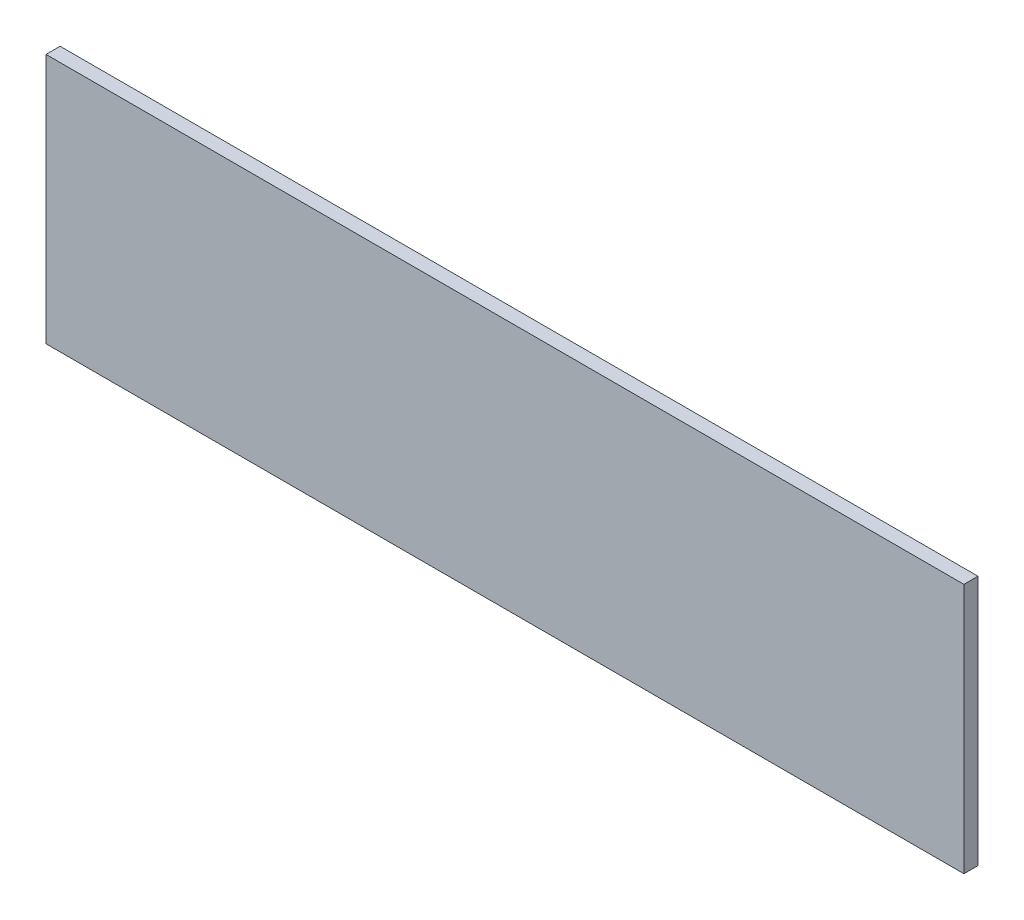
ISO-10303-21;
HEADER;
FILE_DESCRIPTION(('STEP AP214'),'2;1');
FILE_NAME('part.step','',(''),(''),'','','');
FILE_SCHEMA(('AUTOMOTIVE_DESIGN { 1 0 10303 214 1 1 1 1 }'));
ENDSEC;
DATA;
#1=APPLICATION_CONTEXT('core data for automotive mechanical design processes');
#2=APPLICATION_PROTOCOL_DEFINITION('international standard','automotive_design',2000,#1);
#3=PRODUCT_CONTEXT('',#1,'mechanical');
#4=PRODUCT('Part','Part','',(#3));
#5=PRODUCT_RELATED_PRODUCT_CATEGORY('part','',(#4));
#6=PRODUCT_DEFINITION_FORMATION('','',#4);
#7=PRODUCT_DEFINITION_CONTEXT('part definition',#1,'design');
#8=PRODUCT_DEFINITION('design','',#6,#7);
#9=PRODUCT_DEFINITION_SHAPE('','',#8);
#10=(LENGTH_UNIT() NAMED_UNIT(*) SI_UNIT(.MILLI.,.METRE.));
#11=(NAMED_UNIT(*) PLANE_ANGLE_UNIT() SI_UNIT($,.RADIAN.));
#12=(NAMED_UNIT(*) SI_UNIT($,.STERADIAN.) SOLID_ANGLE_UNIT());
#13=UNCERTAINTY_MEASURE_WITH_UNIT(LENGTH_MEASURE(1.E-05),#10,'distance_accuracy_value','');
#14=(GEOMETRIC_REPRESENTATION_CONTEXT(3) GLOBAL_UNCERTAINTY_ASSIGNED_CONTEXT((#13)) GLOBAL_UNIT_ASSIGNED_CONTEXT((#10,
#11,#12)) REPRESENTATION_CONTEXT('',''));
#15=CARTESIAN_POINT('',(0.,0.,0.));
#16=DIRECTION('',(0.,0.,1.));
#17=DIRECTION('',(1.,0.,0.));
#18=AXIS2_PLACEMENT_3D('',#15,#16,#17);
#19=CARTESIAN_POINT('',(-146.5,-40.,4.5));
#20=DIRECTION('',(1.,0.,0.));
#21=DIRECTION('',(0.,0.,-1.));
#22=AXIS2_PLACEMENT_3D('',#19,#20,#21);
#23=PLANE('',#22);
#24=DIRECTION('',(0.,-1.,0.));
#25=VECTOR('',#24,1.);
#26=CARTESIAN_POINT('',(-146.5,-40.,0.));
#27=LINE('',#26,#25);
#28=CARTESIAN_POINT('',(-146.5,40.,0.));
#29=VERTEX_POINT('',#28);
#30=CARTESIAN_POINT('',(-146.5,-40.,0.));
#31=VERTEX_POINT('',#30);
#32=EDGE_CURVE('E95',#29,#31,#27,.T.);
#33=ORIENTED_EDGE('',*,*,#32,.T.);
#34=DIRECTION('',(0.,0.,-1.));
#35=VECTOR('',#34,1.);
#36=CARTESIAN_POINT('',(-146.5,-40.,4.5));
#37=LINE('',#36,#35);
#38=CARTESIAN_POINT('',(-146.5,-40.,4.5));
#39=VERTEX_POINT('',#38);
#40=EDGE_CURVE('E11',#39,#31,#37,.T.);
#41=ORIENTED_EDGE('',*,*,#40,.F.);
#42=DIRECTION('',(0.,-1.,0.));
#43=VECTOR('',#42,1.);
#44=CARTESIAN_POINT('',(-146.5,-40.,4.5));
#45=LINE('',#44,#43);
#46=CARTESIAN_POINT('',(-146.5,40.,4.5));
#47=VERTEX_POINT('',#46);
#48=EDGE_CURVE('E83',#47,#39,#45,.T.);
#49=ORIENTED_EDGE('',*,*,#48,.F.);
#50=DIRECTION('',(0.,0.,-1.));
#51=VECTOR('',#50,1.);
#52=CARTESIAN_POINT('',(-146.5,40.,4.5));
#53=LINE('',#52,#51);
#54=EDGE_CURVE('E91',#47,#29,#53,.T.);
#55=ORIENTED_EDGE('',*,*,#54,.T.);
#56=EDGE_LOOP('',(#33,#41,#49,#55));
#57=FACE_BOUND('',#56,.T.);
#58=ADVANCED_FACE('F32',(#57),#23,.F.);
#59=CARTESIAN_POINT('',(146.5,-40.,4.5));
#60=DIRECTION('',(0.,1.,0.));
#61=DIRECTION('',(-1.,0.,0.));
#62=AXIS2_PLACEMENT_3D('',#59,#60,#61);
#63=PLANE('',#62);
#64=DIRECTION('',(1.,0.,0.));
#65=VECTOR('',#64,1.);
#66=CARTESIAN_POINT('',(146.5,-40.,0.));
#67=LINE('',#66,#65);
#68=CARTESIAN_POINT('',(146.5,-40.,0.));
#69=VERTEX_POINT('',#68);
#70=EDGE_CURVE('E87',#31,#69,#67,.T.);
#71=ORIENTED_EDGE('',*,*,#70,.T.);
#72=DIRECTION('',(0.,0.,-1.));
#73=VECTOR('',#72,1.);
#74=CARTESIAN_POINT('',(146.5,-40.,4.5));
#75=LINE('',#74,#73);
#76=CARTESIAN_POINT('',(146.5,-40.,4.5));
#77=VERTEX_POINT('',#76);
#78=EDGE_CURVE('E40',#77,#69,#75,.T.);
#79=ORIENTED_EDGE('',*,*,#78,.F.);
#80=DIRECTION('',(1.,0.,0.));
#81=VECTOR('',#80,1.);
#82=CARTESIAN_POINT('',(146.5,-40.,4.5));
#83=LINE('',#82,#81);
#84=EDGE_CURVE('E78',#39,#77,#83,.T.);
#85=ORIENTED_EDGE('',*,*,#84,.F.);
#86=ORIENTED_EDGE('',*,*,#40,.T.);
#87=EDGE_LOOP('',(#71,#79,#85,#86));
#88=FACE_BOUND('',#87,.T.);
#89=ADVANCED_FACE('F86',(#88),#63,.F.);
#90=CARTESIAN_POINT('',(146.5,-40.,4.5));
#91=DIRECTION('',(-1.,0.,0.));
#92=DIRECTION('',(0.,0.,1.));
#93=AXIS2_PLACEMENT_3D('',#90,#91,#92);
#94=PLANE('',#93);
#95=DIRECTION('',(0.,1.,0.));
#96=VECTOR('',#95,1.);
#97=CARTESIAN_POINT('',(146.5,-40.,0.));
#98=LINE('',#97,#96);
#99=CARTESIAN_POINT('',(146.5,40.,0.));
#100=VERTEX_POINT('',#99);
#101=EDGE_CURVE('E65',#69,#100,#98,.T.);
#102=ORIENTED_EDGE('',*,*,#101,.T.);
#103=DIRECTION('',(0.,0.,-1.));
#104=VECTOR('',#103,1.);
#105=CARTESIAN_POINT('',(146.5,40.,4.5));
#106=LINE('',#105,#104);
#107=CARTESIAN_POINT('',(146.5,40.,4.5));
#108=VERTEX_POINT('',#107);
#109=EDGE_CURVE('E88',#108,#100,#106,.T.);
#110=ORIENTED_EDGE('',*,*,#109,.F.);
#111=DIRECTION('',(0.,1.,0.));
#112=VECTOR('',#111,1.);
#113=CARTESIAN_POINT('',(146.5,-40.,4.5));
#114=LINE('',#113,#112);
#115=EDGE_CURVE('E81',#77,#108,#114,.T.);
#116=ORIENTED_EDGE('',*,*,#115,.F.);
#117=ORIENTED_EDGE('',*,*,#78,.T.);
#118=EDGE_LOOP('',(#102,#110,#116,#117));
#119=FACE_BOUND('',#118,.T.);
#120=ADVANCED_FACE('F89',(#119),#94,.F.);
#121=CARTESIAN_POINT('',(146.5,40.,4.5));
#122=DIRECTION('',(0.,-1.,0.));
#123=DIRECTION('',(1.,0.,0.));
#124=AXIS2_PLACEMENT_3D('',#121,#122,#123);
#125=PLANE('',#124);
#126=DIRECTION('',(-1.,0.,0.));
#127=VECTOR('',#126,1.);
#128=CARTESIAN_POINT('',(146.5,40.,0.));
#129=LINE('',#128,#127);
#130=EDGE_CURVE('E71',#100,#29,#129,.T.);
#131=ORIENTED_EDGE('',*,*,#130,.T.);
#132=ORIENTED_EDGE('',*,*,#54,.F.);
#133=DIRECTION('',(-1.,0.,0.));
#134=VECTOR('',#133,1.);
#135=CARTESIAN_POINT('',(146.5,40.,4.5));
#136=LINE('',#135,#134);
#137=EDGE_CURVE('E48',#108,#47,#136,.T.);
#138=ORIENTED_EDGE('',*,*,#137,.F.);
#139=ORIENTED_EDGE('',*,*,#109,.T.);
#140=EDGE_LOOP('',(#131,#132,#138,#139));
#141=FACE_BOUND('',#140,.T.);
#142=ADVANCED_FACE('F102',(#141),#125,.F.);
#143=CARTESIAN_POINT('',(0.,0.,4.5));
#144=DIRECTION('',(0.,0.,1.));
#145=DIRECTION('',(1.,0.,0.));
#146=AXIS2_PLACEMENT_3D('',#143,#144,#145);
#147=PLANE('',#146);
#148=ORIENTED_EDGE('',*,*,#48,.T.);
#149=ORIENTED_EDGE('',*,*,#84,.T.);
#150=ORIENTED_EDGE('',*,*,#115,.T.);
#151=ORIENTED_EDGE('',*,*,#137,.T.);
#152=EDGE_LOOP('',(#148,#149,#150,#151));
#153=FACE_BOUND('',#152,.T.);
#154=ADVANCED_FACE('F79',(#153),#147,.T.);
#155=CARTESIAN_POINT('',(0.,0.,0.));
#156=DIRECTION('',(0.,0.,1.));
#157=DIRECTION('',(1.,0.,0.));
#158=AXIS2_PLACEMENT_3D('',#155,#156,#157);
#159=PLANE('',#158);
#160=ORIENTED_EDGE('',*,*,#32,.F.);
#161=ORIENTED_EDGE('',*,*,#130,.F.);
#162=ORIENTED_EDGE('',*,*,#101,.F.);
#163=ORIENTED_EDGE('',*,*,#70,.F.);
#164=EDGE_LOOP('',(#160,#161,#162,#163));
#165=FACE_BOUND('',#164,.T.);
#166=ADVANCED_FACE('F105',(#165),#159,.F.);
#167=CLOSED_SHELL('',(#58,#89,#120,#142,#154,#166));
#168=MANIFOLD_SOLID_BREP('B2',#167);
#169=ADVANCED_BREP_SHAPE_REPRESENTATION('',(#18,#168),#14);
#170=SHAPE_DEFINITION_REPRESENTATION(#9,#169);
ENDSEC;
END-ISO-10303-21;
